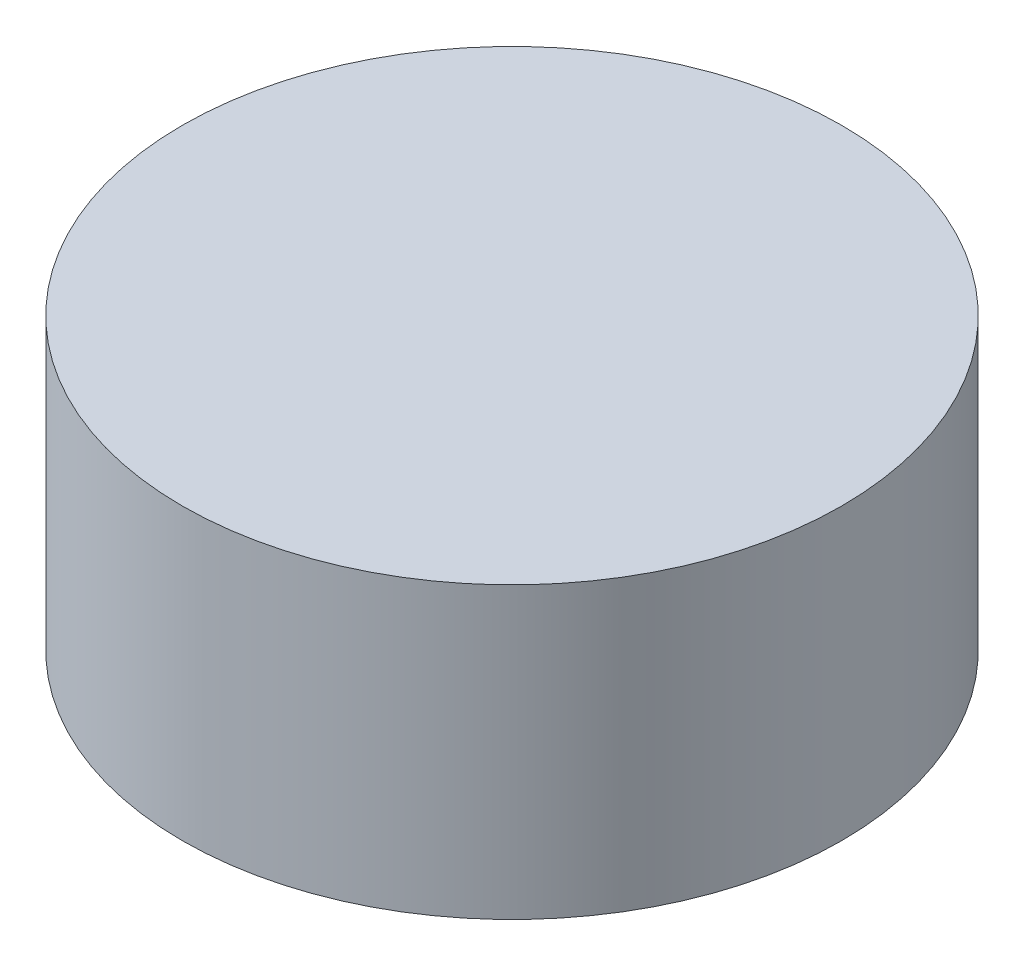
ISO-10303-21;
HEADER;
FILE_DESCRIPTION(('STEP AP214'),'2;1');
FILE_NAME('part.step','',(''),(''),'','','');
FILE_SCHEMA(('AUTOMOTIVE_DESIGN { 1 0 10303 214 1 1 1 1 }'));
ENDSEC;
DATA;
#1=APPLICATION_CONTEXT('core data for automotive mechanical design processes');
#2=APPLICATION_PROTOCOL_DEFINITION('international standard','automotive_design',2000,#1);
#3=PRODUCT_CONTEXT('',#1,'mechanical');
#4=PRODUCT('Part','Part','',(#3));
#5=PRODUCT_RELATED_PRODUCT_CATEGORY('part','',(#4));
#6=PRODUCT_DEFINITION_FORMATION('','',#4);
#7=PRODUCT_DEFINITION_CONTEXT('part definition',#1,'design');
#8=PRODUCT_DEFINITION('design','',#6,#7);
#9=PRODUCT_DEFINITION_SHAPE('','',#8);
#10=(LENGTH_UNIT() NAMED_UNIT(*) SI_UNIT(.MILLI.,.METRE.));
#11=(NAMED_UNIT(*) PLANE_ANGLE_UNIT() SI_UNIT($,.RADIAN.));
#12=(NAMED_UNIT(*) SI_UNIT($,.STERADIAN.) SOLID_ANGLE_UNIT());
#13=UNCERTAINTY_MEASURE_WITH_UNIT(LENGTH_MEASURE(1.E-05),#10,'distance_accuracy_value','');
#14=(GEOMETRIC_REPRESENTATION_CONTEXT(3) GLOBAL_UNCERTAINTY_ASSIGNED_CONTEXT((#13)) GLOBAL_UNIT_ASSIGNED_CONTEXT((#10,
#11,#12)) REPRESENTATION_CONTEXT('',''));
#15=CARTESIAN_POINT('',(0.,0.,0.));
#16=DIRECTION('',(0.,0.,1.));
#17=DIRECTION('',(1.,0.,0.));
#18=AXIS2_PLACEMENT_3D('',#15,#16,#17);
#19=CARTESIAN_POINT('',(0.,2.,0.));
#20=DIRECTION('',(0.,-1.,0.));
#21=DIRECTION('',(0.,0.,-1.));
#22=AXIS2_PLACEMENT_3D('',#19,#20,#21);
#23=CYLINDRICAL_SURFACE('',#22,2.275);
#24=CARTESIAN_POINT('',(0.,2.,0.));
#25=DIRECTION('',(0.,1.,0.));
#26=DIRECTION('',(0.,0.,1.));
#27=AXIS2_PLACEMENT_3D('',#24,#25,#26);
#28=CIRCLE('',#27,2.275);
#29=CARTESIAN_POINT('',(0.,2.,2.275));
#30=VERTEX_POINT('',#29);
#31=EDGE_CURVE('E10',#30,#30,#28,.T.);
#32=ORIENTED_EDGE('',*,*,#31,.F.);
#33=EDGE_LOOP('',(#32));
#34=FACE_BOUND('',#33,.T.);
#35=CARTESIAN_POINT('',(0.,0.,0.));
#36=DIRECTION('',(0.,1.,0.));
#37=DIRECTION('',(0.,0.,1.));
#38=AXIS2_PLACEMENT_3D('',#35,#36,#37);
#39=CIRCLE('',#38,2.275);
#40=CARTESIAN_POINT('',(0.,0.,2.275));
#41=VERTEX_POINT('',#40);
#42=EDGE_CURVE('E41',#41,#41,#39,.T.);
#43=ORIENTED_EDGE('',*,*,#42,.T.);
#44=EDGE_LOOP('',(#43));
#45=FACE_BOUND('',#44,.T.);
#46=ADVANCED_FACE('F38',(#34,#45),#23,.T.);
#47=CARTESIAN_POINT('',(0.,2.,0.));
#48=DIRECTION('',(0.,1.,0.));
#49=DIRECTION('',(0.,0.,1.));
#50=AXIS2_PLACEMENT_3D('',#47,#48,#49);
#51=PLANE('',#50);
#52=ORIENTED_EDGE('',*,*,#31,.T.);
#53=EDGE_LOOP('',(#52));
#54=FACE_BOUND('',#53,.T.);
#55=ADVANCED_FACE('F55',(#54),#51,.T.);
#56=CARTESIAN_POINT('',(0.,0.,0.));
#57=DIRECTION('',(0.,1.,0.));
#58=DIRECTION('',(0.,0.,1.));
#59=AXIS2_PLACEMENT_3D('',#56,#57,#58);
#60=PLANE('',#59);
#61=ORIENTED_EDGE('',*,*,#42,.F.);
#62=EDGE_LOOP('',(#61));
#63=FACE_BOUND('',#62,.T.);
#64=ADVANCED_FACE('F53',(#63),#60,.F.);
#65=CLOSED_SHELL('',(#46,#55,#64));
#66=MANIFOLD_SOLID_BREP('B2',#65);
#67=ADVANCED_BREP_SHAPE_REPRESENTATION('',(#18,#66),#14);
#68=SHAPE_DEFINITION_REPRESENTATION(#9,#67);
ENDSEC;
END-ISO-10303-21;
